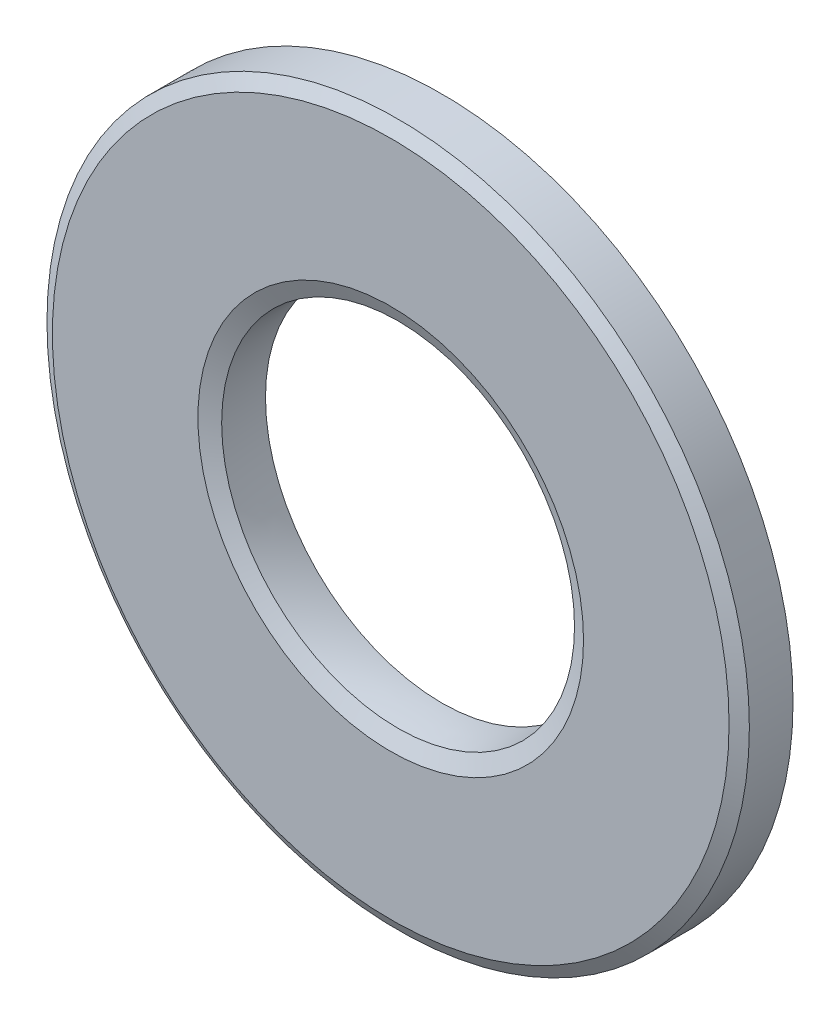
ISO-10303-21;
HEADER;
FILE_DESCRIPTION(('STEP AP214'),'2;1');
FILE_NAME('part.step','',(''),(''),'','','');
FILE_SCHEMA(('AUTOMOTIVE_DESIGN { 1 0 10303 214 1 1 1 1 }'));
ENDSEC;
DATA;
#1=APPLICATION_CONTEXT('core data for automotive mechanical design processes');
#2=APPLICATION_PROTOCOL_DEFINITION('international standard','automotive_design',2000,#1);
#3=PRODUCT_CONTEXT('',#1,'mechanical');
#4=PRODUCT('Part','Part','',(#3));
#5=PRODUCT_RELATED_PRODUCT_CATEGORY('part','',(#4));
#6=PRODUCT_DEFINITION_FORMATION('','',#4);
#7=PRODUCT_DEFINITION_CONTEXT('part definition',#1,'design');
#8=PRODUCT_DEFINITION('design','',#6,#7);
#9=PRODUCT_DEFINITION_SHAPE('','',#8);
#10=(LENGTH_UNIT() NAMED_UNIT(*) SI_UNIT(.MILLI.,.METRE.));
#11=(NAMED_UNIT(*) PLANE_ANGLE_UNIT() SI_UNIT($,.RADIAN.));
#12=(NAMED_UNIT(*) SI_UNIT($,.STERADIAN.) SOLID_ANGLE_UNIT());
#13=UNCERTAINTY_MEASURE_WITH_UNIT(LENGTH_MEASURE(1.E-05),#10,'distance_accuracy_value','');
#14=(GEOMETRIC_REPRESENTATION_CONTEXT(3) GLOBAL_UNCERTAINTY_ASSIGNED_CONTEXT((#13)) GLOBAL_UNIT_ASSIGNED_CONTEXT((#10,
#11,#12)) REPRESENTATION_CONTEXT('',''));
#15=CARTESIAN_POINT('',(0.,0.,0.));
#16=DIRECTION('',(0.,0.,1.));
#17=DIRECTION('',(1.,0.,0.));
#18=AXIS2_PLACEMENT_3D('',#15,#16,#17);
#19=CARTESIAN_POINT('',(0.,0.,0.999999999999997));
#20=DIRECTION('',(0.,0.,1.));
#21=DIRECTION('',(1.,0.,0.));
#22=AXIS2_PLACEMENT_3D('',#19,#20,#21);
#23=PLANE('',#22);
#24=CARTESIAN_POINT('',(0.,0.,0.999999999999997));
#25=DIRECTION('',(0.,0.,1.));
#26=DIRECTION('',(1.,0.,0.));
#27=AXIS2_PLACEMENT_3D('',#24,#25,#26);
#28=CIRCLE('',#27,6.58775294173802);
#29=CARTESIAN_POINT('',(6.58775294173802,0.,0.999999999999997));
#30=VERTEX_POINT('',#29);
#31=EDGE_CURVE('E10',#30,#30,#28,.F.);
#32=ORIENTED_EDGE('',*,*,#31,.T.);
#33=EDGE_LOOP('',(#32));
#34=FACE_BOUND('',#33,.T.);
#35=CARTESIAN_POINT('',(0.,0.,0.999999999999997));
#36=DIRECTION('',(0.,0.,1.));
#37=DIRECTION('',(1.,0.,0.));
#38=AXIS2_PLACEMENT_3D('',#35,#36,#37);
#39=CIRCLE('',#38,11.5600590948775);
#40=CARTESIAN_POINT('',(11.5600590948775,0.,0.999999999999997));
#41=VERTEX_POINT('',#40);
#42=EDGE_CURVE('E59',#41,#41,#39,.T.);
#43=ORIENTED_EDGE('',*,*,#42,.T.);
#44=EDGE_LOOP('',(#43));
#45=FACE_BOUND('',#44,.T.);
#46=ADVANCED_FACE('F39',(#34,#45),#23,.T.);
#47=CARTESIAN_POINT('',(0.,0.,0.999999999999997));
#48=DIRECTION('',(0.,0.,-1.));
#49=DIRECTION('',(-1.,0.,0.));
#50=AXIS2_PLACEMENT_3D('',#47,#48,#49);
#51=CYLINDRICAL_SURFACE('',#50,12.);
#52=CARTESIAN_POINT('',(0.,0.,-0.746000000000001));
#53=DIRECTION('',(0.,0.,1.));
#54=DIRECTION('',(1.,0.,0.));
#55=AXIS2_PLACEMENT_3D('',#52,#53,#54);
#56=CIRCLE('',#55,12.);
#57=CARTESIAN_POINT('',(12.,0.,-0.746000000000001));
#58=VERTEX_POINT('',#57);
#59=EDGE_CURVE('E65',#58,#58,#56,.T.);
#60=ORIENTED_EDGE('',*,*,#59,.T.);
#61=EDGE_LOOP('',(#60));
#62=FACE_BOUND('',#61,.T.);
#63=CARTESIAN_POINT('',(0.,0.,0.745999999999993));
#64=DIRECTION('',(0.,0.,1.));
#65=DIRECTION('',(1.,0.,0.));
#66=AXIS2_PLACEMENT_3D('',#63,#64,#65);
#67=CIRCLE('',#66,12.);
#68=CARTESIAN_POINT('',(12.,0.,0.745999999999993));
#69=VERTEX_POINT('',#68);
#70=EDGE_CURVE('E68',#69,#69,#67,.F.);
#71=ORIENTED_EDGE('',*,*,#70,.T.);
#72=EDGE_LOOP('',(#71));
#73=FACE_BOUND('',#72,.T.);
#74=ADVANCED_FACE('F72',(#62,#73),#51,.T.);
#75=CARTESIAN_POINT('',(0.,0.,-1.));
#76=DIRECTION('',(0.,0.,1.));
#77=DIRECTION('',(1.,0.,0.));
#78=AXIS2_PLACEMENT_3D('',#75,#76,#77);
#79=PLANE('',#78);
#80=CARTESIAN_POINT('',(0.,0.,-1.));
#81=DIRECTION('',(0.,0.,1.));
#82=DIRECTION('',(1.,0.,0.));
#83=AXIS2_PLACEMENT_3D('',#80,#81,#82);
#84=CIRCLE('',#83,6.58775294173802);
#85=CARTESIAN_POINT('',(6.58775294173802,0.,-1.));
#86=VERTEX_POINT('',#85);
#87=EDGE_CURVE('E54',#86,#86,#84,.T.);
#88=ORIENTED_EDGE('',*,*,#87,.T.);
#89=EDGE_LOOP('',(#88));
#90=FACE_BOUND('',#89,.T.);
#91=CARTESIAN_POINT('',(0.,0.,-1.));
#92=DIRECTION('',(0.,0.,1.));
#93=DIRECTION('',(1.,0.,0.));
#94=AXIS2_PLACEMENT_3D('',#91,#92,#93);
#95=CIRCLE('',#94,11.5600590948775);
#96=CARTESIAN_POINT('',(11.5600590948775,0.,-1.));
#97=VERTEX_POINT('',#96);
#98=EDGE_CURVE('E62',#97,#97,#95,.F.);
#99=ORIENTED_EDGE('',*,*,#98,.T.);
#100=EDGE_LOOP('',(#99));
#101=FACE_BOUND('',#100,.T.);
#102=ADVANCED_FACE('F88',(#90,#101),#79,.F.);
#103=CARTESIAN_POINT('',(0.,0.,-0.746000000000001));
#104=DIRECTION('',(0.,0.,1.));
#105=DIRECTION('',(1.,0.,0.));
#106=AXIS2_PLACEMENT_3D('',#103,#104,#105);
#107=CONICAL_SURFACE('',#106,12.,1.04719755119659);
#108=ORIENTED_EDGE('',*,*,#98,.F.);
#109=EDGE_LOOP('',(#108));
#110=FACE_BOUND('',#109,.T.);
#111=ORIENTED_EDGE('',*,*,#59,.F.);
#112=EDGE_LOOP('',(#111));
#113=FACE_BOUND('',#112,.T.);
#114=ADVANCED_FACE('F78',(#110,#113),#107,.T.);
#115=CARTESIAN_POINT('',(0.,0.,0.999999999999997));
#116=DIRECTION('',(0.,0.,-1.));
#117=DIRECTION('',(-1.,0.,0.));
#118=AXIS2_PLACEMENT_3D('',#115,#116,#117);
#119=CONICAL_SURFACE('',#118,11.5600590948775,1.04719755119659);
#120=ORIENTED_EDGE('',*,*,#70,.F.);
#121=EDGE_LOOP('',(#120));
#122=FACE_BOUND('',#121,.T.);
#123=ORIENTED_EDGE('',*,*,#42,.F.);
#124=EDGE_LOOP('',(#123));
#125=FACE_BOUND('',#124,.T.);
#126=ADVANCED_FACE('F74',(#122,#125),#119,.T.);
#127=CARTESIAN_POINT('',(0.,0.,0.));
#128=DIRECTION('',(0.,0.,1.));
#129=DIRECTION('',(0.,-1.,0.));
#130=AXIS2_PLACEMENT_3D('',#127,#128,#129);
#131=TOROIDAL_SURFACE('',#130,15.8679196850393,9.86791968503927);
#132=CARTESIAN_POINT('',(0.,0.,-0.748831629141167));
#133=DIRECTION('',(0.,0.,1.));
#134=DIRECTION('',(1.,0.,0.));
#135=AXIS2_PLACEMENT_3D('',#132,#133,#134);
#136=CIRCLE('',#135,6.02845373908553);
#137=CARTESIAN_POINT('',(6.02845373908553,0.,-0.748831629141167));
#138=VERTEX_POINT('',#137);
#139=EDGE_CURVE('E46',#138,#138,#136,.F.);
#140=ORIENTED_EDGE('',*,*,#139,.T.);
#141=EDGE_LOOP('',(#140));
#142=FACE_BOUND('',#141,.T.);
#143=CARTESIAN_POINT('',(0.,0.,0.748831629141154));
#144=DIRECTION('',(0.,0.,-1.));
#145=DIRECTION('',(-1.,0.,0.));
#146=AXIS2_PLACEMENT_3D('',#143,#144,#145);
#147=CIRCLE('',#146,6.02845373908553);
#148=CARTESIAN_POINT('',(-6.02845373908553,0.,0.748831629141154));
#149=VERTEX_POINT('',#148);
#150=EDGE_CURVE('E50',#149,#149,#147,.F.);
#151=ORIENTED_EDGE('',*,*,#150,.T.);
#152=EDGE_LOOP('',(#151));
#153=FACE_BOUND('',#152,.T.);
#154=ADVANCED_FACE('F77',(#142,#153),#131,.T.);
#155=CARTESIAN_POINT('',(0.,0.,-1.));
#156=DIRECTION('',(0.,0.,-1.));
#157=DIRECTION('',(-1.,0.,0.));
#158=AXIS2_PLACEMENT_3D('',#155,#156,#157);
#159=CONICAL_SURFACE('',#158,6.58775294173801,1.14871028859814);
#160=ORIENTED_EDGE('',*,*,#139,.F.);
#161=EDGE_LOOP('',(#160));
#162=FACE_BOUND('',#161,.T.);
#163=ORIENTED_EDGE('',*,*,#87,.F.);
#164=EDGE_LOOP('',(#163));
#165=FACE_BOUND('',#164,.T.);
#166=ADVANCED_FACE('F96',(#162,#165),#159,.F.);
#167=CARTESIAN_POINT('',(0.,0.,0.748831629141155));
#168=DIRECTION('',(0.,0.,1.));
#169=DIRECTION('',(1.,0.,0.));
#170=AXIS2_PLACEMENT_3D('',#167,#168,#169);
#171=CONICAL_SURFACE('',#170,6.02845373908553,1.14871028859814);
#172=ORIENTED_EDGE('',*,*,#31,.F.);
#173=EDGE_LOOP('',(#172));
#174=FACE_BOUND('',#173,.T.);
#175=ORIENTED_EDGE('',*,*,#150,.F.);
#176=EDGE_LOOP('',(#175));
#177=FACE_BOUND('',#176,.T.);
#178=ADVANCED_FACE('F41',(#174,#177),#171,.F.);
#179=CLOSED_SHELL('',(#46,#74,#102,#114,#126,#154,#166,#178));
#180=MANIFOLD_SOLID_BREP('B2',#179);
#181=ADVANCED_BREP_SHAPE_REPRESENTATION('',(#18,#180),#14);
#182=SHAPE_DEFINITION_REPRESENTATION(#9,#181);
ENDSEC;
END-ISO-10303-21;
